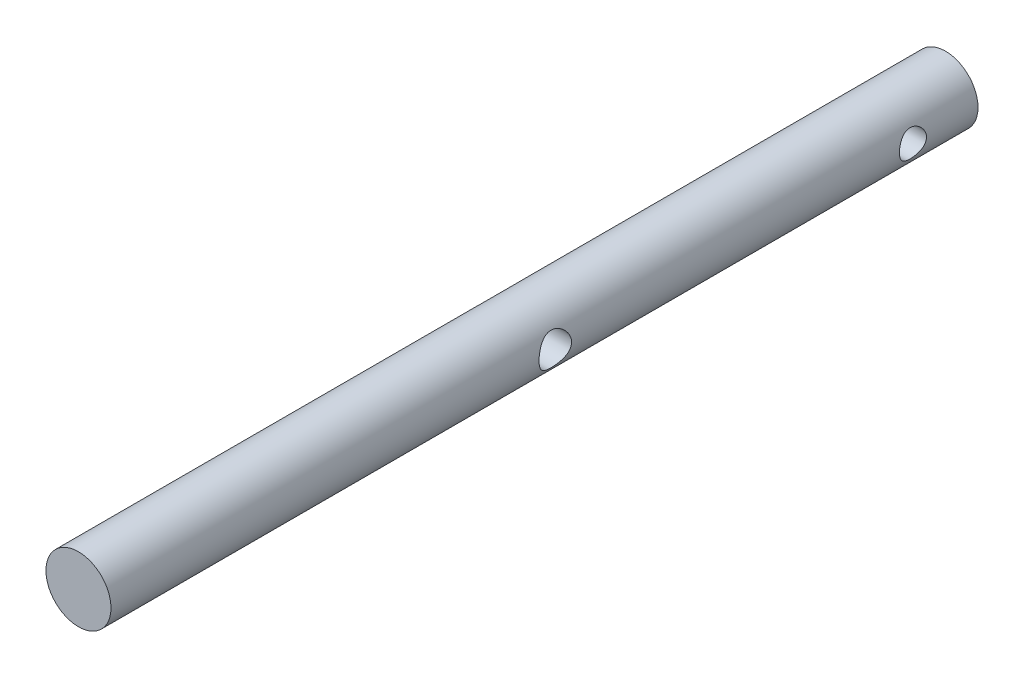
ISO-10303-21;
HEADER;
FILE_DESCRIPTION(('STEP AP214'),'2;1');
FILE_NAME('part.step','',(''),(''),'','','');
FILE_SCHEMA(('AUTOMOTIVE_DESIGN { 1 0 10303 214 1 1 1 1 }'));
ENDSEC;
DATA;
#1=APPLICATION_CONTEXT('core data for automotive mechanical design processes');
#2=APPLICATION_PROTOCOL_DEFINITION('international standard','automotive_design',2000,#1);
#3=PRODUCT_CONTEXT('',#1,'mechanical');
#4=PRODUCT('Part','Part','',(#3));
#5=PRODUCT_RELATED_PRODUCT_CATEGORY('part','',(#4));
#6=PRODUCT_DEFINITION_FORMATION('','',#4);
#7=PRODUCT_DEFINITION_CONTEXT('part definition',#1,'design');
#8=PRODUCT_DEFINITION('design','',#6,#7);
#9=PRODUCT_DEFINITION_SHAPE('','',#8);
#10=(LENGTH_UNIT() NAMED_UNIT(*) SI_UNIT(.MILLI.,.METRE.));
#11=(NAMED_UNIT(*) PLANE_ANGLE_UNIT() SI_UNIT($,.RADIAN.));
#12=(NAMED_UNIT(*) SI_UNIT($,.STERADIAN.) SOLID_ANGLE_UNIT());
#13=UNCERTAINTY_MEASURE_WITH_UNIT(LENGTH_MEASURE(1.E-05),#10,'distance_accuracy_value','');
#14=(GEOMETRIC_REPRESENTATION_CONTEXT(3) GLOBAL_UNCERTAINTY_ASSIGNED_CONTEXT((#13)) GLOBAL_UNIT_ASSIGNED_CONTEXT((#10,
#11,#12)) REPRESENTATION_CONTEXT('',''));
#15=CARTESIAN_POINT('',(0.,0.,0.));
#16=DIRECTION('',(0.,0.,1.));
#17=DIRECTION('',(1.,0.,0.));
#18=AXIS2_PLACEMENT_3D('',#15,#16,#17);
#19=CARTESIAN_POINT('',(0.,0.,80.));
#20=DIRECTION('',(0.,0.,-1.));
#21=DIRECTION('',(-1.,0.,0.));
#22=AXIS2_PLACEMENT_3D('',#19,#20,#21);
#23=CYLINDRICAL_SURFACE('',#22,3.);
#24=CARTESIAN_POINT('',(0.,0.,39.));
#25=DIRECTION('',(-0.707106781186547,0.,-0.707106781186547));
#26=DIRECTION('',(0.707106781186547,0.,-0.707106781186547));
#27=AXIS2_PLACEMENT_3D('',#24,#25,#26);
#28=ELLIPSE('',#27,4.24264068711929,3.);
#29=CARTESIAN_POINT('',(-2.,2.23606797749979,41.));
#30=VERTEX_POINT('',#29);
#31=CARTESIAN_POINT('',(-2.,-2.23606797749979,41.));
#32=VERTEX_POINT('',#31);
#33=EDGE_CURVE('E41',#30,#32,#28,.F.);
#34=ORIENTED_EDGE('',*,*,#33,.T.);
#35=DIRECTION('',(0.,0.,-1.));
#36=VECTOR('',#35,1.);
#37=CARTESIAN_POINT('',(-2.,-2.23606797749979,80.));
#38=LINE('',#37,#36);
#39=CARTESIAN_POINT('',(-2.,-2.23606797749979,37.));
#40=VERTEX_POINT('',#39);
#41=EDGE_CURVE('E65',#32,#40,#38,.T.);
#42=ORIENTED_EDGE('',*,*,#41,.T.);
#43=CARTESIAN_POINT('',(0.,0.,39.));
#44=DIRECTION('',(0.707106781186547,0.,-0.707106781186547));
#45=DIRECTION('',(-0.707106781186547,0.,-0.707106781186547));
#46=AXIS2_PLACEMENT_3D('',#43,#44,#45);
#47=ELLIPSE('',#46,4.24264068711929,3.);
#48=CARTESIAN_POINT('',(-2.,2.23606797749979,37.));
#49=VERTEX_POINT('',#48);
#50=EDGE_CURVE('E11',#40,#49,#47,.T.);
#51=ORIENTED_EDGE('',*,*,#50,.T.);
#52=DIRECTION('',(0.,0.,-1.));
#53=VECTOR('',#52,1.);
#54=CARTESIAN_POINT('',(-2.,2.23606797749979,80.));
#55=LINE('',#54,#53);
#56=EDGE_CURVE('E59',#49,#30,#55,.F.);
#57=ORIENTED_EDGE('',*,*,#56,.T.);
#58=EDGE_LOOP('',(#34,#42,#51,#57));
#59=FACE_BOUND('',#58,.T.);
#60=CARTESIAN_POINT('',(-3.,0.,7.25));
#61=CARTESIAN_POINT('',(-2.99999458367273,-0.0669580526362664,7.24999279490871));
#62=CARTESIAN_POINT('',(-2.9977323297471,-0.13402139706384,7.24458804147187));
#63=CARTESIAN_POINT('',(-2.98890153579552,-0.266247371156346,7.22316093507982));
#64=CARTESIAN_POINT('',(-2.98232175901028,-0.331404576423564,7.20711087553575));
#65=CARTESIAN_POINT('',(-2.96556289038127,-0.457688733653087,7.16508890821941));
#66=CARTESIAN_POINT('',(-2.95539599975004,-0.518828524426268,7.13915061053185));
#67=CARTESIAN_POINT('',(-2.93245286470664,-0.635829756679802,7.07822717676743));
#68=CARTESIAN_POINT('',(-2.91967741092849,-0.691692790015939,7.04324478102913));
#69=CARTESIAN_POINT('',(-2.89207828351869,-0.799448403559511,6.96337101740912));
#70=CARTESIAN_POINT('',(-2.87718753326093,-0.851041267517767,6.91809869121025));
#71=CARTESIAN_POINT('',(-2.84732714068514,-0.946159821091261,6.81973566521743));
#72=CARTESIAN_POINT('',(-2.83235746106809,-0.989681263153084,6.76664087510549));
#73=CARTESIAN_POINT('',(-2.80321021812995,-1.06953737697065,6.65097322243511));
#74=CARTESIAN_POINT('',(-2.78910786873385,-1.10541308153925,6.58806255157346));
#75=CARTESIAN_POINT('',(-2.76435572357005,-1.16593940588866,6.45642674207907));
#76=CARTESIAN_POINT('',(-2.75370415000823,-1.19059580836291,6.38770462051555));
#77=CARTESIAN_POINT('',(-2.73778555387705,-1.22674598312159,6.24984630823208));
#78=CARTESIAN_POINT('',(-2.73228387651787,-1.23881657877605,6.18088951660785));
#79=CARTESIAN_POINT('',(-2.72661326219504,-1.25125209967796,6.04172670731343));
#80=CARTESIAN_POINT('',(-2.7264413842526,-1.25162348054397,5.97152139997426));
#81=CARTESIAN_POINT('',(-2.73125119560853,-1.24108450363674,5.83759993956506));
#82=CARTESIAN_POINT('',(-2.73583882723623,-1.23103681112301,5.77379890343554));
#83=CARTESIAN_POINT('',(-2.74898482773796,-1.20139191015776,5.64888790899961));
#84=CARTESIAN_POINT('',(-2.75754395703564,-1.18179287287177,5.58777846850823));
#85=CARTESIAN_POINT('',(-2.77786184772756,-1.13321958727571,5.46844229700856));
#86=CARTESIAN_POINT('',(-2.78968481949136,-1.10405471539236,5.41030457908662));
#87=CARTESIAN_POINT('',(-2.81518331141086,-1.03731242580562,5.29952226611986));
#88=CARTESIAN_POINT('',(-2.82885956129779,-0.999731690519543,5.24687984938648));
#89=CARTESIAN_POINT('',(-2.85792976877979,-0.913495965543834,5.14390004126716));
#90=CARTESIAN_POINT('',(-2.87337121404473,-0.864173483207525,5.09413343261456));
#91=CARTESIAN_POINT('',(-2.90325673112529,-0.757729591051511,5.00338649704082));
#92=CARTESIAN_POINT('',(-2.9177005687701,-0.700606359448456,4.96240822830782));
#93=CARTESIAN_POINT('',(-2.94438283556473,-0.578447948693376,4.88956417638374));
#94=CARTESIAN_POINT('',(-2.95656266543334,-0.51326058244768,4.85793055484932));
#95=CARTESIAN_POINT('',(-2.97689481414803,-0.377852402526832,4.80627886039674));
#96=CARTESIAN_POINT('',(-2.985049358458,-0.307634394795035,4.78625436805619));
#97=CARTESIAN_POINT('',(-2.99599641186385,-0.168928113346229,4.75958400787337));
#98=CARTESIAN_POINT('',(-2.99909541047125,-0.10061128527864,4.75217214255625));
#99=CARTESIAN_POINT('',(-3.00056050368745,0.0363546554960881,4.74865377638591));
#100=CARTESIAN_POINT('',(-2.99892795711939,0.105003667152635,4.752544029748));
#101=CARTESIAN_POINT('',(-2.9913121765694,0.237098242341434,4.77097108480607));
#102=CARTESIAN_POINT('',(-2.98554887283989,0.300632966639386,4.7849699540972));
#103=CARTESIAN_POINT('',(-2.97048606772414,0.42438274897109,4.82246819454079));
#104=CARTESIAN_POINT('',(-2.96118611959704,0.48459738651836,4.8459687659503));
#105=CARTESIAN_POINT('',(-2.93958270645166,0.602108999869135,4.90257097571212));
#106=CARTESIAN_POINT('',(-2.92719491469281,0.659257236855323,4.93594818314603));
#107=CARTESIAN_POINT('',(-2.9007380457909,0.767346216231428,5.0110533777917));
#108=CARTESIAN_POINT('',(-2.88666826768733,0.81828435260194,5.05278485152928));
#109=CARTESIAN_POINT('',(-2.85712087895438,0.916333430274262,5.14690323327241));
#110=CARTESIAN_POINT('',(-2.84161451591029,0.962910697979834,5.19983850298626));
#111=CARTESIAN_POINT('',(-2.81184336768005,1.04666984610551,5.31302127593539));
#112=CARTESIAN_POINT('',(-2.79757886493438,1.08384959285617,5.37327043517173));
#113=CARTESIAN_POINT('',(-2.77181386243988,1.14815960208699,5.50061417530258));
#114=CARTESIAN_POINT('',(-2.76035562555111,1.17513918237329,5.56779403551483));
#115=CARTESIAN_POINT('',(-2.74208355658957,1.21717413951573,5.70637059381011));
#116=CARTESIAN_POINT('',(-2.73526589555752,1.23223934863687,5.77776376248335));
#117=CARTESIAN_POINT('',(-2.72763164537264,1.249040803489,5.91681869919921));
#118=CARTESIAN_POINT('',(-2.72639350967163,1.25171380413129,5.98434466229262));
#119=CARTESIAN_POINT('',(-2.72893853011024,1.24615575523912,6.1188428611411));
#120=CARTESIAN_POINT('',(-2.73272091540306,1.23792637964721,6.18581518031369));
#121=CARTESIAN_POINT('',(-2.74449551302268,1.21158404780491,6.31409274746889));
#122=CARTESIAN_POINT('',(-2.7522835484648,1.19394903571466,6.37551667346339));
#123=CARTESIAN_POINT('',(-2.77103181199189,1.14976328202134,6.49454802135723));
#124=CARTESIAN_POINT('',(-2.78199293131693,1.12321003517252,6.55215436539878));
#125=CARTESIAN_POINT('',(-2.80666954560013,1.06010285935489,6.66569589594912));
#126=CARTESIAN_POINT('',(-2.82051102713679,1.02304360910483,6.72132233016829));
#127=CARTESIAN_POINT('',(-2.84903689053839,0.94068407263039,6.82586013936068));
#128=CARTESIAN_POINT('',(-2.86372156345875,0.895380928905618,6.87476917560057));
#129=CARTESIAN_POINT('',(-2.89356392850106,0.79390204577882,6.96814868168474));
#130=CARTESIAN_POINT('',(-2.90867817511792,0.737174739949026,7.01203643284065));
#131=CARTESIAN_POINT('',(-2.9366014362202,0.616600079253198,7.08969945354362));
#132=CARTESIAN_POINT('',(-2.9494093991674,0.552749497945744,7.12347011488955));
#133=CARTESIAN_POINT('',(-2.97109183362461,0.420732056717949,7.17920984543988));
#134=CARTESIAN_POINT('',(-2.98002782581964,0.352653990980636,7.2013647666173));
#135=CARTESIAN_POINT('',(-2.99321009768625,0.213410421846559,7.23370632907783));
#136=CARTESIAN_POINT('',(-2.99747105811967,0.142255316980957,7.24393044252988));
#137=CARTESIAN_POINT('',(-2.99972287568934,0.0472360819191831,7.24933316108645));
#138=CARTESIAN_POINT('',(-3.00000191102536,0.023624594675657,7.25000254214923));
#139=CARTESIAN_POINT('',(-3.,0.,7.25));
#140=B_SPLINE_CURVE_WITH_KNOTS('',3,(#60,#61,#62,#63,#64,#65,#66,#67,#68,#69,#70,#71,#72,#73,
#74,#75,#76,#77,#78,#79,#80,#81,#82,#83,#84,#85,#86,#87,#88,#89,#90,#91,#92,#93,#94,#95,#96,#97,
#98,#99,#100,#101,#102,#103,#104,#105,#106,#107,#108,#109,#110,#111,#112,#113,#114,#115,#116,
#117,#118,#119,#120,#121,#122,#123,#124,#125,#126,#127,#128,#129,#130,#131,#132,#133,#134,#135,
#136,#137,#138,#139),.UNSPECIFIED.,.T.,.F.,(4,2,2,2,2,2,2,2,2,2,2,2,2,2,2,2,2,2,2,2,2,2,2,2,2,2,
2,2,2,2,2,2,2,2,2,2,2,2,2,4),(0.,0.200806918883938,0.402138540628696,0.602791851906302,
0.803384436852974,1.01317936288807,1.22308438131465,1.44331724539125,1.66343646730588,
1.87295273137557,2.08235338249046,2.27570157202556,2.46908679727212,2.66658713058714,
2.86416545717206,3.07844141127896,3.29276749314588,3.51204055060813,3.73119224218296,
3.9364844339325,4.14171767493171,4.33676589735721,4.53183876601784,4.7329713527216,
4.93418805469495,5.14978488029293,5.36543061240341,5.58414788359523,5.8026844707458,
6.00439877559643,6.20608211297535,6.39837649964761,6.59072494950612,6.7946389339744,
6.99862373425943,7.21746535004888,7.43640649428581,7.65172855819384,7.8663725046932,
7.93722256499097),.UNSPECIFIED.);
#141=CARTESIAN_POINT('',(-3.,0.,7.25));
#142=VERTEX_POINT('',#141);
#143=EDGE_CURVE('E163',#142,#142,#140,.T.);
#144=ORIENTED_EDGE('',*,*,#143,.T.);
#145=EDGE_LOOP('',(#144));
#146=FACE_BOUND('',#145,.T.);
#147=CARTESIAN_POINT('',(3.,0.,4.75));
#148=CARTESIAN_POINT('',(2.99999458367273,-0.0669580526362667,4.7500072050913));
#149=CARTESIAN_POINT('',(2.9977323297471,-0.134021397063841,4.75541195852814));
#150=CARTESIAN_POINT('',(2.98890153579552,-0.266247371156347,4.77683906492018));
#151=CARTESIAN_POINT('',(2.98232175901028,-0.331404576423564,4.79288912446425));
#152=CARTESIAN_POINT('',(2.96556289038127,-0.457688733653087,4.83491109178059));
#153=CARTESIAN_POINT('',(2.95539599975004,-0.518828524426268,4.86084938946815));
#154=CARTESIAN_POINT('',(2.93245286470664,-0.635829756679801,4.92177282323257));
#155=CARTESIAN_POINT('',(2.91967741092849,-0.691692790015938,4.95675521897087));
#156=CARTESIAN_POINT('',(2.89207828351869,-0.799448403559511,5.03662898259088));
#157=CARTESIAN_POINT('',(2.87718753326093,-0.851041267517767,5.08190130878975));
#158=CARTESIAN_POINT('',(2.84732714068514,-0.946159821091261,5.18026433478257));
#159=CARTESIAN_POINT('',(2.83235746106809,-0.989681263153084,5.23335912489451));
#160=CARTESIAN_POINT('',(2.80321021812995,-1.06953737697065,5.3490267775649));
#161=CARTESIAN_POINT('',(2.78910786873385,-1.10541308153925,5.41193744842654));
#162=CARTESIAN_POINT('',(2.76435572357005,-1.16593940588866,5.54357325792093));
#163=CARTESIAN_POINT('',(2.75370415000823,-1.19059580836291,5.61229537948445));
#164=CARTESIAN_POINT('',(2.73778555387705,-1.22674598312159,5.75015369176792));
#165=CARTESIAN_POINT('',(2.73228387651787,-1.23881657877605,5.81911048339215));
#166=CARTESIAN_POINT('',(2.72661326219504,-1.25125209967796,5.95827329268657));
#167=CARTESIAN_POINT('',(2.7264413842526,-1.25162348054397,6.02847860002574));
#168=CARTESIAN_POINT('',(2.73125119560853,-1.24108450363674,6.16240006043494));
#169=CARTESIAN_POINT('',(2.73583882723623,-1.23103681112301,6.22620109656446));
#170=CARTESIAN_POINT('',(2.74898482773796,-1.20139191015776,6.35111209100039));
#171=CARTESIAN_POINT('',(2.75754395703564,-1.18179287287177,6.41222153149177));
#172=CARTESIAN_POINT('',(2.77786184772756,-1.13321958727571,6.53155770299144));
#173=CARTESIAN_POINT('',(2.78968481949136,-1.10405471539236,6.58969542091338));
#174=CARTESIAN_POINT('',(2.81518331141086,-1.03731242580562,6.70047773388014));
#175=CARTESIAN_POINT('',(2.82885956129779,-0.999731690519543,6.75312015061352));
#176=CARTESIAN_POINT('',(2.85792976877979,-0.913495965543834,6.85609995873284));
#177=CARTESIAN_POINT('',(2.87337121404473,-0.864173483207526,6.90586656738544));
#178=CARTESIAN_POINT('',(2.90325673112529,-0.757729591051511,6.99661350295918));
#179=CARTESIAN_POINT('',(2.9177005687701,-0.700606359448456,7.03759177169218));
#180=CARTESIAN_POINT('',(2.94438283556473,-0.578447948693376,7.11043582361626));
#181=CARTESIAN_POINT('',(2.95656266543334,-0.51326058244768,7.14206944515068));
#182=CARTESIAN_POINT('',(2.97689481414803,-0.377852402526832,7.19372113960326));
#183=CARTESIAN_POINT('',(2.985049358458,-0.307634394795035,7.21374563194381));
#184=CARTESIAN_POINT('',(2.99599641186385,-0.168928113346229,7.24041599212663));
#185=CARTESIAN_POINT('',(2.99909541047125,-0.10061128527864,7.24782785744375));
#186=CARTESIAN_POINT('',(3.00056050368745,0.0363546554960877,7.25134622361409));
#187=CARTESIAN_POINT('',(2.99892795711939,0.105003667152634,7.247455970252));
#188=CARTESIAN_POINT('',(2.9913121765694,0.237098242341433,7.22902891519393));
#189=CARTESIAN_POINT('',(2.98554887283989,0.300632966639385,7.2150300459028));
#190=CARTESIAN_POINT('',(2.97048606772414,0.424382748971089,7.17753180545921));
#191=CARTESIAN_POINT('',(2.96118611959704,0.484597386518359,7.1540312340497));
#192=CARTESIAN_POINT('',(2.93958270645166,0.602108999869135,7.09742902428788));
#193=CARTESIAN_POINT('',(2.92719491469281,0.659257236855322,7.06405181685397));
#194=CARTESIAN_POINT('',(2.9007380457909,0.767346216231428,6.9889466222083));
#195=CARTESIAN_POINT('',(2.88666826768733,0.818284352601939,6.94721514847072));
#196=CARTESIAN_POINT('',(2.85712087895437,0.916333430274262,6.85309676672759));
#197=CARTESIAN_POINT('',(2.84161451591029,0.962910697979833,6.80016149701374));
#198=CARTESIAN_POINT('',(2.81184336768005,1.04666984610551,6.68697872406461));
#199=CARTESIAN_POINT('',(2.79757886493438,1.08384959285617,6.62672956482827));
#200=CARTESIAN_POINT('',(2.77181386243988,1.14815960208699,6.49938582469743));
#201=CARTESIAN_POINT('',(2.76035562555111,1.17513918237329,6.43220596448517));
#202=CARTESIAN_POINT('',(2.74208355658957,1.21717413951573,6.29362940618989));
#203=CARTESIAN_POINT('',(2.73526589555752,1.23223934863687,6.22223623751665));
#204=CARTESIAN_POINT('',(2.72763164537264,1.249040803489,6.08318130080079));
#205=CARTESIAN_POINT('',(2.72639350967163,1.25171380413129,6.01565533770739));
#206=CARTESIAN_POINT('',(2.72893853011024,1.24615575523912,5.8811571388589));
#207=CARTESIAN_POINT('',(2.73272091540306,1.23792637964721,5.81418481968631));
#208=CARTESIAN_POINT('',(2.74449551302268,1.21158404780491,5.68590725253111));
#209=CARTESIAN_POINT('',(2.7522835484648,1.19394903571466,5.62448332653661));
#210=CARTESIAN_POINT('',(2.77103181199189,1.14976328202134,5.50545197864277));
#211=CARTESIAN_POINT('',(2.78199293131693,1.12321003517252,5.44784563460122));
#212=CARTESIAN_POINT('',(2.80666954560013,1.06010285935489,5.33430410405088));
#213=CARTESIAN_POINT('',(2.82051102713679,1.02304360910483,5.27867766983171));
#214=CARTESIAN_POINT('',(2.84903689053839,0.94068407263039,5.17413986063932));
#215=CARTESIAN_POINT('',(2.86372156345875,0.895380928905618,5.12523082439943));
#216=CARTESIAN_POINT('',(2.89356392850106,0.79390204577882,5.03185131831526));
#217=CARTESIAN_POINT('',(2.90867817511792,0.737174739949027,4.98796356715935));
#218=CARTESIAN_POINT('',(2.9366014362202,0.616600079253198,4.91030054645638));
#219=CARTESIAN_POINT('',(2.9494093991674,0.552749497945745,4.87652988511045));
#220=CARTESIAN_POINT('',(2.97109183362461,0.42073205671795,4.82079015456012));
#221=CARTESIAN_POINT('',(2.98002782581964,0.352653990980636,4.7986352333827));
#222=CARTESIAN_POINT('',(2.99321009768625,0.213410421846559,4.76629367092217));
#223=CARTESIAN_POINT('',(2.99747105811967,0.142255316980958,4.75606955747012));
#224=CARTESIAN_POINT('',(2.99972287568934,0.0472360819191835,4.75066683891355));
#225=CARTESIAN_POINT('',(3.00000191102536,0.0236245946756572,4.74999745785078));
#226=CARTESIAN_POINT('',(3.,0.,4.75));
#227=B_SPLINE_CURVE_WITH_KNOTS('',3,(#147,#148,#149,#150,#151,#152,#153,#154,#155,#156,#157,
#158,#159,#160,#161,#162,#163,#164,#165,#166,#167,#168,#169,#170,#171,#172,#173,#174,#175,#176,
#177,#178,#179,#180,#181,#182,#183,#184,#185,#186,#187,#188,#189,#190,#191,#192,#193,#194,#195,
#196,#197,#198,#199,#200,#201,#202,#203,#204,#205,#206,#207,#208,#209,#210,#211,#212,#213,#214,
#215,#216,#217,#218,#219,#220,#221,#222,#223,#224,#225,#226),.UNSPECIFIED.,.T.,.F.,(4,2,2,2,2,2,
2,2,2,2,2,2,2,2,2,2,2,2,2,2,2,2,2,2,2,2,2,2,2,2,2,2,2,2,2,2,2,2,2,4),(0.,0.200806918883938,
0.402138540628696,0.6027918519063,0.803384436852973,1.01317936288807,1.22308438131465,
1.44331724539125,1.66343646730588,1.87295273137557,2.08235338249046,2.27570157202556,
2.46908679727212,2.66658713058714,2.86416545717206,3.07844141127896,3.29276749314587,
3.51204055060813,3.73119224218296,3.9364844339325,4.14171767493171,4.33676589735721,
4.53183876601784,4.7329713527216,4.93418805469495,5.14978488029293,5.3654306124034,
5.58414788359523,5.8026844707458,6.00439877559643,6.20608211297535,6.39837649964762,
6.59072494950612,6.7946389339744,6.99862373425943,7.21746535004888,7.43640649428581,
7.65172855819384,7.8663725046932,7.93722256499097),.UNSPECIFIED.);
#228=CARTESIAN_POINT('',(3.,0.,4.75));
#229=VERTEX_POINT('',#228);
#230=EDGE_CURVE('E86',#229,#229,#227,.T.);
#231=ORIENTED_EDGE('',*,*,#230,.T.);
#232=EDGE_LOOP('',(#231));
#233=FACE_BOUND('',#232,.T.);
#234=CARTESIAN_POINT('',(3.,0.,37.5));
#235=CARTESIAN_POINT('',(2.99999570107562,-0.0788579444268501,37.5000049534758));
#236=CARTESIAN_POINT('',(2.99685736529634,-0.157809899546343,37.5062551096816));
#237=CARTESIAN_POINT('',(2.98461234055735,-0.313380352903344,37.5309793205123));
#238=CARTESIAN_POINT('',(2.97549431743379,-0.389994130070445,37.5494765894967));
#239=CARTESIAN_POINT('',(2.95224419105063,-0.538400317320675,37.5977907129249));
#240=CARTESIAN_POINT('',(2.93813158766306,-0.610210204408721,37.6275635763719));
#241=CARTESIAN_POINT('',(2.90618664773642,-0.7477089252099,37.6973559320475));
#242=CARTESIAN_POINT('',(2.88835460450288,-0.813398240985091,37.7373746163733));
#243=CARTESIAN_POINT('',(2.84934387387093,-0.941261726642865,37.8292758742279));
#244=CARTESIAN_POINT('',(2.82802798691306,-1.00298281668316,37.8817297188595));
#245=CARTESIAN_POINT('',(2.78489955370114,-1.11716916730047,37.9957822188705));
#246=CARTESIAN_POINT('',(2.76308664313552,-1.16962737466015,38.0573877776587));
#247=CARTESIAN_POINT('',(2.71948426796021,-1.26787800067542,38.1937250242851));
#248=CARTESIAN_POINT('',(2.69782780455198,-1.31283800332746,38.2691041475189));
#249=CARTESIAN_POINT('',(2.6592896815848,-1.38925234033605,38.4275510039793));
#250=CARTESIAN_POINT('',(2.64240461410484,-1.4207163224495,38.5106131930841));
#251=CARTESIAN_POINT('',(2.61686800556712,-1.46719866328289,38.6769976581329));
#252=CARTESIAN_POINT('',(2.6077840737557,-1.48308878562067,38.7600066781011));
#253=CARTESIAN_POINT('',(2.59772834922791,-1.50064048996327,38.9279682566692));
#254=CARTESIAN_POINT('',(2.59674854014932,-1.50231613255961,39.0129188113067));
#255=CARTESIAN_POINT('',(2.60266395385872,-1.49203093075845,39.1714290364731));
#256=CARTESIAN_POINT('',(2.6086314549302,-1.48167683930524,39.2451360468346));
#257=CARTESIAN_POINT('',(2.62614343100775,-1.4504097735854,39.3895828640596));
#258=CARTESIAN_POINT('',(2.63768968247664,-1.42949343584648,39.460321717958));
#259=CARTESIAN_POINT('',(2.66531214619111,-1.37731467057901,39.5988436988485));
#260=CARTESIAN_POINT('',(2.68148760995998,-1.34582260067399,39.6665195981787));
#261=CARTESIAN_POINT('',(2.71655106422105,-1.273562531502,39.795951438885));
#262=CARTESIAN_POINT('',(2.73544027170286,-1.2327903657187,39.8577047034001));
#263=CARTESIAN_POINT('',(2.77669736854928,-1.13709908236919,39.9817818791148));
#264=CARTESIAN_POINT('',(2.79920265355119,-1.08104168755392,40.0431853103642));
#265=CARTESIAN_POINT('',(2.84321434950611,-0.959333368112058,40.1561031278864));
#266=CARTESIAN_POINT('',(2.86472027938201,-0.893677884861428,40.2076127880508));
#267=CARTESIAN_POINT('',(2.90552980924446,-0.750774758747773,40.3015284915446));
#268=CARTESIAN_POINT('',(2.92468476243011,-0.673130387399112,40.3434007086686));
#269=CARTESIAN_POINT('',(2.95736821681863,-0.510699323233194,40.4131455435645));
#270=CARTESIAN_POINT('',(2.9709011841533,-0.425918364397914,40.4410292775228));
#271=CARTESIAN_POINT('',(2.98986500612153,-0.259149737491055,40.479713105575));
#272=CARTESIAN_POINT('',(2.99587407451965,-0.177512295822491,40.4917368536202));
#273=CARTESIAN_POINT('',(3.00109520188655,-0.0131693999240305,40.5021970967017));
#274=CARTESIAN_POINT('',(3.00031048081978,0.0695355298048594,40.5006400284592));
#275=CARTESIAN_POINT('',(2.99236788380152,0.226849457978976,40.4846899673719));
#276=CARTESIAN_POINT('',(2.98570868532252,0.301589112074891,40.471301200905));
#277=CARTESIAN_POINT('',(2.9673325697226,0.447610338452908,40.4336428921573));
#278=CARTESIAN_POINT('',(2.95561509501618,0.518891528536628,40.4093721503198));
#279=CARTESIAN_POINT('',(2.92776377120382,0.658332912674357,40.3500023003505));
#280=CARTESIAN_POINT('',(2.91151322654446,0.726345595508703,40.3146134248256));
#281=CARTESIAN_POINT('',(2.87615961476126,0.855692042548906,40.2343386965302));
#282=CARTESIAN_POINT('',(2.85705533350407,0.917022944664886,40.1894487981069));
#283=CARTESIAN_POINT('',(2.81562332004297,1.03765153393382,40.0863593620039));
#284=CARTESIAN_POINT('',(2.79316327265249,1.09615811672854,40.0272856973323));
#285=CARTESIAN_POINT('',(2.7489358741323,1.20278448167828,39.9001122730834));
#286=CARTESIAN_POINT('',(2.7271690110007,1.25089707856781,39.8320063217281));
#287=CARTESIAN_POINT('',(2.68576788309734,1.33756187171853,39.6845345187405));
#288=CARTESIAN_POINT('',(2.66628794383591,1.37553824370037,39.6047831008583));
#289=CARTESIAN_POINT('',(2.63361108441202,1.43712423890206,39.4387348986376));
#290=CARTESIAN_POINT('',(2.62040607332625,1.46075237380053,39.3524467102997));
#291=CARTESIAN_POINT('',(2.60342251538703,1.49079253120031,39.1846346656729));
#292=CARTESIAN_POINT('',(2.59886075197597,1.49863949460818,39.1034486198471));
#293=CARTESIAN_POINT('',(2.59748031962405,1.50103373156431,38.9408293992532));
#294=CARTESIAN_POINT('',(2.60065829439585,1.49558676993487,38.8593963468932));
#295=CARTESIAN_POINT('',(2.61356793076614,1.47288918838997,38.7067747476999));
#296=CARTESIAN_POINT('',(2.62264641723987,1.45681247151456,38.6353492947829));
#297=CARTESIAN_POINT('',(2.64556524281479,1.41476303733662,38.4962878208635));
#298=CARTESIAN_POINT('',(2.65940711354502,1.38878713673989,38.428653026862));
#299=CARTESIAN_POINT('',(2.69142795546803,1.32572361795085,38.2940627235202));
#300=CARTESIAN_POINT('',(2.70983583593881,1.28800670672356,38.2274581472565));
#301=CARTESIAN_POINT('',(2.7485299745229,1.20322645745609,38.1010881957281));
#302=CARTESIAN_POINT('',(2.76881720693416,1.15615825686235,38.0413264042183));
#303=CARTESIAN_POINT('',(2.81193484737138,1.04730498999207,37.922787026468));
#304=CARTESIAN_POINT('',(2.83477474959942,0.984426634495898,37.8650113464746));
#305=CARTESIAN_POINT('',(2.87816628389896,0.849232209349802,37.7606055248471));
#306=CARTESIAN_POINT('',(2.89871667939292,0.776911084957803,37.7139813907951));
#307=CARTESIAN_POINT('',(2.93547014349806,0.623897395174428,37.6331454559319));
#308=CARTESIAN_POINT('',(2.95164144740899,0.543149255665106,37.5990237461453));
#309=CARTESIAN_POINT('',(2.9775201194848,0.376113151707138,37.5452877483639));
#310=CARTESIAN_POINT('',(2.98724585044602,0.289841699383657,37.5256322297914));
#311=CARTESIAN_POINT('',(2.99543192870217,0.168902919736348,37.5091538833714));
#312=CARTESIAN_POINT('',(2.99714048010376,0.135242819162351,37.5057260387005));
#313=CARTESIAN_POINT('',(2.99942545465223,0.0677275977076395,37.5011480017289));
#314=CARTESIAN_POINT('',(3.00000184655071,0.0338724714699437,37.4999978722947));
#315=CARTESIAN_POINT('',(3.,0.,37.5));
#316=B_SPLINE_CURVE_WITH_KNOTS('',3,(#234,#235,#236,#237,#238,#239,#240,#241,#242,#243,#244,
#245,#246,#247,#248,#249,#250,#251,#252,#253,#254,#255,#256,#257,#258,#259,#260,#261,#262,#263,
#264,#265,#266,#267,#268,#269,#270,#271,#272,#273,#274,#275,#276,#277,#278,#279,#280,#281,#282,
#283,#284,#285,#286,#287,#288,#289,#290,#291,#292,#293,#294,#295,#296,#297,#298,#299,#300,#301,
#302,#303,#304,#305,#306,#307,#308,#309,#310,#311,#312,#313,#314,#315),.UNSPECIFIED.,.T.,.F.,(4,
2,2,2,2,2,2,2,2,2,2,2,2,2,2,2,2,2,2,2,2,2,2,2,2,2,2,2,2,2,2,2,2,2,2,2,2,2,2,2,4),(0.,
0.236436386130438,0.473322224563797,0.709293233238448,0.945245640872351,1.19547263807713,
1.44588935648105,1.71572589646129,1.98536921847422,2.23887018210346,2.49212035993531,
2.71508568613981,2.93812205888519,3.16635360252732,3.39468781890334,3.65197412000819,
3.90938301898031,4.17874533321662,4.44789325368421,4.6947493570702,4.94148846767215,
5.16910359759184,5.39674382446399,5.63089284041849,5.8651417612251,6.12239415966629,
6.37982382923149,6.6497202324259,6.91926767918178,7.16293961254572,7.40650589797019,
7.62686895373285,7.84730293182529,8.08254685170433,8.31791341715448,8.5818786413576,
8.8459857507187,9.11196020495292,9.37717362931726,9.47872920200878,9.58028757766602),.UNSPECIFIED.);
#317=CARTESIAN_POINT('',(3.,0.,37.5));
#318=VERTEX_POINT('',#317);
#319=EDGE_CURVE('E78',#318,#318,#316,.T.);
#320=ORIENTED_EDGE('',*,*,#319,.T.);
#321=EDGE_LOOP('',(#320));
#322=FACE_BOUND('',#321,.T.);
#323=CARTESIAN_POINT('',(0.,0.,80.));
#324=DIRECTION('',(0.,0.,1.));
#325=DIRECTION('',(1.,0.,0.));
#326=AXIS2_PLACEMENT_3D('',#323,#324,#325);
#327=CIRCLE('',#326,3.);
#328=CARTESIAN_POINT('',(3.,0.,80.));
#329=VERTEX_POINT('',#328);
#330=EDGE_CURVE('E74',#329,#329,#327,.T.);
#331=ORIENTED_EDGE('',*,*,#330,.F.);
#332=EDGE_LOOP('',(#331));
#333=FACE_BOUND('',#332,.T.);
#334=CARTESIAN_POINT('',(0.,0.,0.));
#335=DIRECTION('',(0.,0.,1.));
#336=DIRECTION('',(1.,0.,0.));
#337=AXIS2_PLACEMENT_3D('',#334,#335,#336);
#338=CIRCLE('',#337,3.);
#339=CARTESIAN_POINT('',(3.,0.,0.));
#340=VERTEX_POINT('',#339);
#341=EDGE_CURVE('E71',#340,#340,#338,.T.);
#342=ORIENTED_EDGE('',*,*,#341,.T.);
#343=EDGE_LOOP('',(#342));
#344=FACE_BOUND('',#343,.T.);
#345=ADVANCED_FACE('F33',(#59,#146,#233,#322,#333,#344),#23,.T.);
#346=CARTESIAN_POINT('',(0.,0.,80.));
#347=DIRECTION('',(0.,0.,1.));
#348=DIRECTION('',(1.,0.,0.));
#349=AXIS2_PLACEMENT_3D('',#346,#347,#348);
#350=PLANE('',#349);
#351=ORIENTED_EDGE('',*,*,#330,.T.);
#352=EDGE_LOOP('',(#351));
#353=FACE_BOUND('',#352,.T.);
#354=ADVANCED_FACE('F101',(#353),#350,.T.);
#355=CARTESIAN_POINT('',(0.,0.,0.));
#356=DIRECTION('',(0.,0.,1.));
#357=DIRECTION('',(1.,0.,0.));
#358=AXIS2_PLACEMENT_3D('',#355,#356,#357);
#359=PLANE('',#358);
#360=ORIENTED_EDGE('',*,*,#341,.F.);
#361=EDGE_LOOP('',(#360));
#362=FACE_BOUND('',#361,.T.);
#363=ADVANCED_FACE('F97',(#362),#359,.F.);
#364=CARTESIAN_POINT('',(-3.,0.,39.));
#365=DIRECTION('',(1.,0.,0.));
#366=DIRECTION('',(0.,0.,-1.));
#367=AXIS2_PLACEMENT_3D('',#364,#365,#366);
#368=CYLINDRICAL_SURFACE('',#367,1.5);
#369=CARTESIAN_POINT('',(-2.,0.,39.));
#370=DIRECTION('',(1.,0.,0.));
#371=DIRECTION('',(0.,0.,-1.));
#372=AXIS2_PLACEMENT_3D('',#369,#370,#371);
#373=CIRCLE('',#372,1.5);
#374=CARTESIAN_POINT('',(-2.,0.,37.5));
#375=VERTEX_POINT('',#374);
#376=EDGE_CURVE('E66',#375,#375,#373,.F.);
#377=ORIENTED_EDGE('',*,*,#376,.T.);
#378=EDGE_LOOP('',(#377));
#379=FACE_BOUND('',#378,.T.);
#380=ORIENTED_EDGE('',*,*,#319,.F.);
#381=EDGE_LOOP('',(#380));
#382=FACE_BOUND('',#381,.T.);
#383=ADVANCED_FACE('F92',(#379,#382),#368,.F.);
#384=CARTESIAN_POINT('',(-3.,0.,6.));
#385=DIRECTION('',(1.,0.,0.));
#386=DIRECTION('',(0.,0.,-1.));
#387=AXIS2_PLACEMENT_3D('',#384,#385,#386);
#388=CYLINDRICAL_SURFACE('',#387,1.25);
#389=ORIENTED_EDGE('',*,*,#230,.F.);
#390=EDGE_LOOP('',(#389));
#391=FACE_BOUND('',#390,.T.);
#392=ORIENTED_EDGE('',*,*,#143,.F.);
#393=EDGE_LOOP('',(#392));
#394=FACE_BOUND('',#393,.T.);
#395=ADVANCED_FACE('F96',(#391,#394),#388,.F.);
#396=CARTESIAN_POINT('',(-4.,0.,39.));
#397=DIRECTION('',(1.,0.,0.));
#398=DIRECTION('',(0.,0.,-1.));
#399=AXIS2_PLACEMENT_3D('',#396,#397,#398);
#400=CYLINDRICAL_SURFACE('',#399,3.);
#401=CARTESIAN_POINT('',(-2.,0.,39.));
#402=DIRECTION('',(1.,0.,0.));
#403=DIRECTION('',(0.,0.,-1.));
#404=AXIS2_PLACEMENT_3D('',#401,#402,#403);
#405=CIRCLE('',#404,3.);
#406=EDGE_CURVE('E61',#40,#49,#405,.T.);
#407=ORIENTED_EDGE('',*,*,#406,.T.);
#408=ORIENTED_EDGE('',*,*,#50,.F.);
#409=EDGE_LOOP('',(#407,#408));
#410=FACE_BOUND('',#409,.T.);
#411=ADVANCED_FACE('F68',(#410),#400,.F.);
#412=EDGE_CURVE('E48',#30,#32,#405,.T.);
#413=ORIENTED_EDGE('',*,*,#412,.T.);
#414=ORIENTED_EDGE('',*,*,#33,.F.);
#415=EDGE_LOOP('',(#413,#414));
#416=FACE_BOUND('',#415,.T.);
#417=ADVANCED_FACE('F140',(#416),#400,.F.);
#418=CARTESIAN_POINT('',(-2.,0.,39.));
#419=DIRECTION('',(1.,0.,0.));
#420=DIRECTION('',(0.,0.,-1.));
#421=AXIS2_PLACEMENT_3D('',#418,#419,#420);
#422=PLANE('',#421);
#423=ORIENTED_EDGE('',*,*,#376,.F.);
#424=EDGE_LOOP('',(#423));
#425=FACE_BOUND('',#424,.T.);
#426=ORIENTED_EDGE('',*,*,#412,.F.);
#427=ORIENTED_EDGE('',*,*,#56,.F.);
#428=ORIENTED_EDGE('',*,*,#406,.F.);
#429=ORIENTED_EDGE('',*,*,#41,.F.);
#430=EDGE_LOOP('',(#426,#427,#428,#429));
#431=FACE_BOUND('',#430,.T.);
#432=ADVANCED_FACE('F60',(#425,#431),#422,.F.);
#433=CLOSED_SHELL('',(#345,#354,#363,#383,#395,#411,#417,#432));
#434=MANIFOLD_SOLID_BREP('B2',#433);
#435=ADVANCED_BREP_SHAPE_REPRESENTATION('',(#18,#434),#14);
#436=SHAPE_DEFINITION_REPRESENTATION(#9,#435);
ENDSEC;
END-ISO-10303-21;
